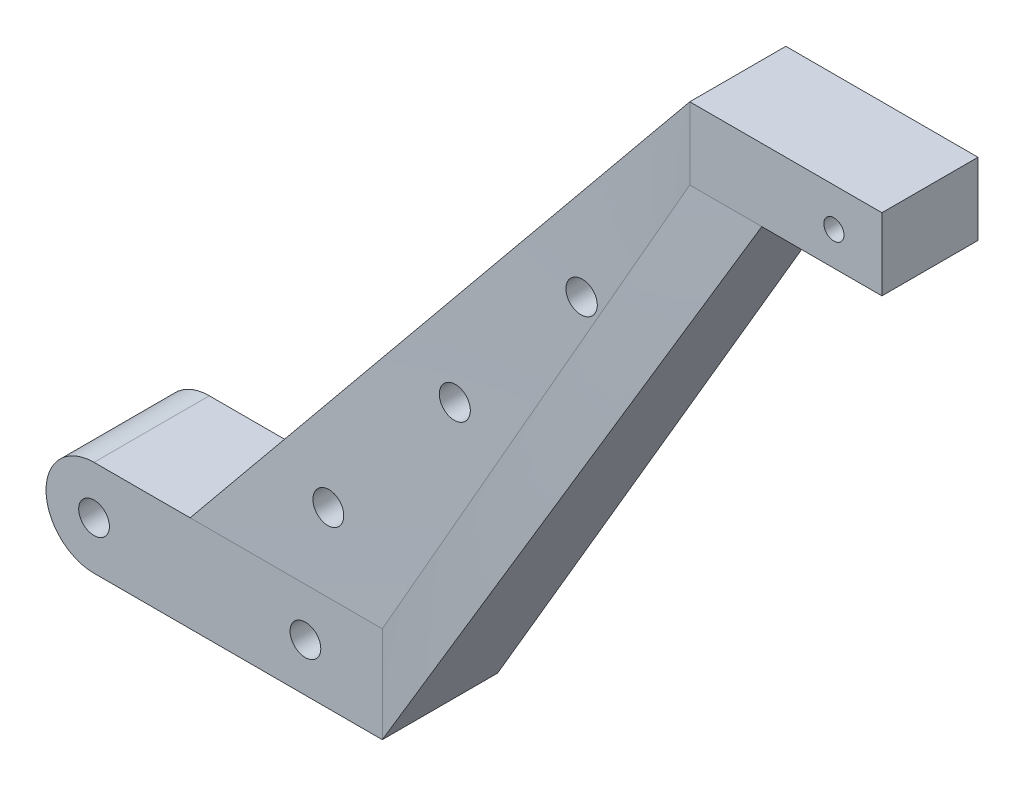
ISO-10303-21;
HEADER;
FILE_DESCRIPTION(('STEP AP214'),'2;1');
FILE_NAME('part.step','',(''),(''),'','','');
FILE_SCHEMA(('AUTOMOTIVE_DESIGN { 1 0 10303 214 1 1 1 1 }'));
ENDSEC;
DATA;
#1=APPLICATION_CONTEXT('core data for automotive mechanical design processes');
#2=APPLICATION_PROTOCOL_DEFINITION('international standard','automotive_design',2000,#1);
#3=PRODUCT_CONTEXT('',#1,'mechanical');
#4=PRODUCT('Part','Part','',(#3));
#5=PRODUCT_RELATED_PRODUCT_CATEGORY('part','',(#4));
#6=PRODUCT_DEFINITION_FORMATION('','',#4);
#7=PRODUCT_DEFINITION_CONTEXT('part definition',#1,'design');
#8=PRODUCT_DEFINITION('design','',#6,#7);
#9=PRODUCT_DEFINITION_SHAPE('','',#8);
#10=(LENGTH_UNIT() NAMED_UNIT(*) SI_UNIT(.MILLI.,.METRE.));
#11=(NAMED_UNIT(*) PLANE_ANGLE_UNIT() SI_UNIT($,.RADIAN.));
#12=(NAMED_UNIT(*) SI_UNIT($,.STERADIAN.) SOLID_ANGLE_UNIT());
#13=UNCERTAINTY_MEASURE_WITH_UNIT(LENGTH_MEASURE(1.E-05),#10,'distance_accuracy_value','');
#14=(GEOMETRIC_REPRESENTATION_CONTEXT(3) GLOBAL_UNCERTAINTY_ASSIGNED_CONTEXT((#13)) GLOBAL_UNIT_ASSIGNED_CONTEXT((#10,
#11,#12)) REPRESENTATION_CONTEXT('',''));
#15=CARTESIAN_POINT('',(0.,0.,0.));
#16=DIRECTION('',(0.,0.,1.));
#17=DIRECTION('',(1.,0.,0.));
#18=AXIS2_PLACEMENT_3D('',#15,#16,#17);
#19=CARTESIAN_POINT('',(-8.,0.,10.5254833995939));
#20=DIRECTION('',(0.,0.,-1.));
#21=DIRECTION('',(-1.,0.,0.));
#22=AXIS2_PLACEMENT_3D('',#19,#20,#21);
#23=CYLINDRICAL_SURFACE('',#22,1.6);
#24=CARTESIAN_POINT('',(-8.,0.,6.));
#25=DIRECTION('',(0.,0.,1.));
#26=DIRECTION('',(1.,0.,0.));
#27=AXIS2_PLACEMENT_3D('',#24,#25,#26);
#28=CIRCLE('',#27,1.6);
#29=CARTESIAN_POINT('',(-6.4,0.,6.));
#30=VERTEX_POINT('',#29);
#31=EDGE_CURVE('E421',#30,#30,#28,.F.);
#32=ORIENTED_EDGE('',*,*,#31,.F.);
#33=EDGE_LOOP('',(#32));
#34=FACE_BOUND('',#33,.T.);
#35=CARTESIAN_POINT('',(-8.,0.,-2.));
#36=DIRECTION('',(0.,0.,-1.));
#37=DIRECTION('',(-1.,0.,0.));
#38=AXIS2_PLACEMENT_3D('',#35,#36,#37);
#39=CIRCLE('',#38,1.6);
#40=CARTESIAN_POINT('',(-9.60000000000001,0.,-2.));
#41=VERTEX_POINT('',#40);
#42=EDGE_CURVE('E66',#41,#41,#39,.F.);
#43=ORIENTED_EDGE('',*,*,#42,.F.);
#44=EDGE_LOOP('',(#43));
#45=FACE_BOUND('',#44,.T.);
#46=ADVANCED_FACE('F62',(#34,#45),#23,.F.);
#47=CARTESIAN_POINT('',(-30.,0.,10.5254833995939));
#48=DIRECTION('',(0.,0.,-1.));
#49=DIRECTION('',(-1.,0.,0.));
#50=AXIS2_PLACEMENT_3D('',#47,#48,#49);
#51=CYLINDRICAL_SURFACE('',#50,1.6);
#52=CARTESIAN_POINT('',(-30.,0.,6.));
#53=DIRECTION('',(0.,0.,1.));
#54=DIRECTION('',(1.,0.,0.));
#55=AXIS2_PLACEMENT_3D('',#52,#53,#54);
#56=CIRCLE('',#55,1.6);
#57=CARTESIAN_POINT('',(-28.4,0.,6.));
#58=VERTEX_POINT('',#57);
#59=EDGE_CURVE('E383',#58,#58,#56,.F.);
#60=ORIENTED_EDGE('',*,*,#59,.F.);
#61=EDGE_LOOP('',(#60));
#62=FACE_BOUND('',#61,.T.);
#63=CARTESIAN_POINT('',(-30.,0.,-2.));
#64=DIRECTION('',(0.,0.,-1.));
#65=DIRECTION('',(-1.,0.,0.));
#66=AXIS2_PLACEMENT_3D('',#63,#64,#65);
#67=CIRCLE('',#66,1.6);
#68=CARTESIAN_POINT('',(-31.6,0.,-2.));
#69=VERTEX_POINT('',#68);
#70=EDGE_CURVE('E410',#69,#69,#67,.F.);
#71=ORIENTED_EDGE('',*,*,#70,.F.);
#72=EDGE_LOOP('',(#71));
#73=FACE_BOUND('',#72,.T.);
#74=ADVANCED_FACE('F345',(#62,#73),#51,.F.);
#75=CARTESIAN_POINT('',(-20.,-5.,-6.));
#76=DIRECTION('',(0.,0.,-1.));
#77=DIRECTION('',(-1.,0.,0.));
#78=AXIS2_PLACEMENT_3D('',#75,#76,#77);
#79=PLANE('',#78);
#80=CARTESIAN_POINT('',(19.3511806739083,43.8906747121906,-6.));
#81=DIRECTION('',(0.,0.,-1.));
#82=DIRECTION('',(-1.,0.,0.));
#83=AXIS2_PLACEMENT_3D('',#80,#81,#82);
#84=CIRCLE('',#83,1.6);
#85=CARTESIAN_POINT('',(17.7511806739083,43.8906747121906,-6.));
#86=VERTEX_POINT('',#85);
#87=EDGE_CURVE('E639',#86,#86,#84,.T.);
#88=ORIENTED_EDGE('',*,*,#87,.F.);
#89=EDGE_LOOP('',(#88));
#90=FACE_BOUND('',#89,.T.);
#91=CARTESIAN_POINT('',(6.73457898301116,28.3722546323871,-6.));
#92=DIRECTION('',(0.,0.,-1.));
#93=DIRECTION('',(-1.,0.,0.));
#94=AXIS2_PLACEMENT_3D('',#91,#92,#93);
#95=CIRCLE('',#94,1.6);
#96=CARTESIAN_POINT('',(5.13457898301115,28.3722546323871,-6.));
#97=VERTEX_POINT('',#96);
#98=EDGE_CURVE('E638',#97,#97,#95,.T.);
#99=ORIENTED_EDGE('',*,*,#98,.F.);
#100=EDGE_LOOP('',(#99));
#101=FACE_BOUND('',#100,.T.);
#102=CARTESIAN_POINT('',(-5.88202270788604,12.8538345525835,-6.));
#103=DIRECTION('',(0.,0.,-1.));
#104=DIRECTION('',(-1.,0.,0.));
#105=AXIS2_PLACEMENT_3D('',#102,#103,#104);
#106=CIRCLE('',#105,1.6);
#107=CARTESIAN_POINT('',(-7.48202270788604,12.8538345525835,-6.));
#108=VERTEX_POINT('',#107);
#109=EDGE_CURVE('E438',#108,#108,#106,.T.);
#110=ORIENTED_EDGE('',*,*,#109,.F.);
#111=EDGE_LOOP('',(#110));
#112=FACE_BOUND('',#111,.T.);
#113=CARTESIAN_POINT('',(-8.,0.,-6.));
#114=DIRECTION('',(0.,0.,-1.));
#115=DIRECTION('',(-1.,0.,0.));
#116=AXIS2_PLACEMENT_3D('',#113,#114,#115);
#117=CIRCLE('',#116,3.1);
#118=CARTESIAN_POINT('',(-11.1,0.,-6.));
#119=VERTEX_POINT('',#118);
#120=EDGE_CURVE('E425',#119,#119,#117,.T.);
#121=ORIENTED_EDGE('',*,*,#120,.F.);
#122=EDGE_LOOP('',(#121));
#123=FACE_BOUND('',#122,.T.);
#124=CARTESIAN_POINT('',(-30.,0.,-6.));
#125=DIRECTION('',(0.,0.,-1.));
#126=DIRECTION('',(-1.,0.,0.));
#127=AXIS2_PLACEMENT_3D('',#124,#125,#126);
#128=CIRCLE('',#127,3.1);
#129=CARTESIAN_POINT('',(-33.1,0.,-6.));
#130=VERTEX_POINT('',#129);
#131=EDGE_CURVE('E417',#130,#130,#128,.T.);
#132=ORIENTED_EDGE('',*,*,#131,.F.);
#133=EDGE_LOOP('',(#132));
#134=FACE_BOUND('',#133,.T.);
#135=CARTESIAN_POINT('',(45.,62.5,-6.));
#136=DIRECTION('',(0.,0.,-1.));
#137=DIRECTION('',(-1.,0.,0.));
#138=AXIS2_PLACEMENT_3D('',#135,#136,#137);
#139=CIRCLE('',#138,1.05);
#140=CARTESIAN_POINT('',(43.95,62.5,-6.));
#141=VERTEX_POINT('',#140);
#142=EDGE_CURVE('E142',#141,#141,#139,.T.);
#143=ORIENTED_EDGE('',*,*,#142,.F.);
#144=EDGE_LOOP('',(#143));
#145=FACE_BOUND('',#144,.T.);
#146=DIRECTION('',(1.,0.,0.));
#147=VECTOR('',#146,1.);
#148=CARTESIAN_POINT('',(-20.,-5.,-6.));
#149=LINE('',#148,#147);
#150=CARTESIAN_POINT('',(-30.,-5.,-6.));
#151=VERTEX_POINT('',#150);
#152=CARTESIAN_POINT('',(0.,-5.,-6.));
#153=VERTEX_POINT('',#152);
#154=EDGE_CURVE('E234',#151,#153,#149,.T.);
#155=ORIENTED_EDGE('',*,*,#154,.F.);
#156=CARTESIAN_POINT('',(-30.,0.,-6.));
#157=DIRECTION('',(0.,0.,-1.));
#158=DIRECTION('',(-1.,0.,0.));
#159=AXIS2_PLACEMENT_3D('',#156,#157,#158);
#160=CIRCLE('',#159,5.);
#161=CARTESIAN_POINT('',(-35.,0.,-6.));
#162=VERTEX_POINT('',#161);
#163=EDGE_CURVE('E71',#151,#162,#160,.T.);
#164=ORIENTED_EDGE('',*,*,#163,.T.);
#165=CARTESIAN_POINT('',(-30.,0.,-6.));
#166=DIRECTION('',(0.,0.,-1.));
#167=DIRECTION('',(-1.,0.,0.));
#168=AXIS2_PLACEMENT_3D('',#165,#166,#167);
#169=CIRCLE('',#168,5.);
#170=CARTESIAN_POINT('',(-30.,5.,-6.));
#171=VERTEX_POINT('',#170);
#172=EDGE_CURVE('E79',#162,#171,#169,.T.);
#173=ORIENTED_EDGE('',*,*,#172,.T.);
#174=DIRECTION('',(1.,0.,0.));
#175=VECTOR('',#174,1.);
#176=CARTESIAN_POINT('',(-35.,5.,-6.));
#177=LINE('',#176,#175);
#178=CARTESIAN_POINT('',(-20.,5.,-6.));
#179=VERTEX_POINT('',#178);
#180=EDGE_CURVE('E135',#171,#179,#177,.T.);
#181=ORIENTED_EDGE('',*,*,#180,.T.);
#182=DIRECTION('',(0.63083008454486,0.775921003990177,0.));
#183=VECTOR('',#182,1.);
#184=CARTESIAN_POINT('',(-20.,5.,-6.));
#185=LINE('',#184,#183);
#186=CARTESIAN_POINT('',(30.,66.5,-6.));
#187=VERTEX_POINT('',#186);
#188=EDGE_CURVE('E139',#179,#187,#185,.T.);
#189=ORIENTED_EDGE('',*,*,#188,.T.);
#190=DIRECTION('',(-1.,0.,0.));
#191=VECTOR('',#190,1.);
#192=CARTESIAN_POINT('',(62.5,66.5,-6.));
#193=LINE('',#192,#191);
#194=CARTESIAN_POINT('',(50.,66.5,-6.));
#195=VERTEX_POINT('',#194);
#196=EDGE_CURVE('E293',#195,#187,#193,.T.);
#197=ORIENTED_EDGE('',*,*,#196,.F.);
#198=DIRECTION('',(0.,1.,0.));
#199=VECTOR('',#198,1.);
#200=CARTESIAN_POINT('',(50.,59.,-6.));
#201=LINE('',#200,#199);
#202=CARTESIAN_POINT('',(50.,59.,-6.));
#203=VERTEX_POINT('',#202);
#204=EDGE_CURVE('E281',#203,#195,#201,.T.);
#205=ORIENTED_EDGE('',*,*,#204,.F.);
#206=DIRECTION('',(-1.,0.,0.));
#207=VECTOR('',#206,1.);
#208=CARTESIAN_POINT('',(62.5,59.,-6.));
#209=LINE('',#208,#207);
#210=CARTESIAN_POINT('',(37.5,59.,-6.));
#211=VERTEX_POINT('',#210);
#212=EDGE_CURVE('E698',#203,#211,#209,.T.);
#213=ORIENTED_EDGE('',*,*,#212,.T.);
#214=DIRECTION('',(0.505546500182335,0.862799360311186,0.));
#215=VECTOR('',#214,1.);
#216=CARTESIAN_POINT('',(0.,-5.,-6.));
#217=LINE('',#216,#215);
#218=EDGE_CURVE('E394',#153,#211,#217,.T.);
#219=ORIENTED_EDGE('',*,*,#218,.F.);
#220=EDGE_LOOP('',(#155,#164,#173,#181,#189,#197,#205,#213,#219));
#221=FACE_BOUND('',#220,.T.);
#222=ADVANCED_FACE('F137',(#90,#101,#112,#123,#134,#145,#221),#79,.T.);
#223=CARTESIAN_POINT('',(-20.,-5.,6.));
#224=DIRECTION('',(0.,-1.,0.));
#225=DIRECTION('',(0.,0.,-1.));
#226=AXIS2_PLACEMENT_3D('',#223,#224,#225);
#227=PLANE('',#226);
#228=DIRECTION('',(1.,0.,0.));
#229=VECTOR('',#228,1.);
#230=CARTESIAN_POINT('',(-20.,-5.,6.));
#231=LINE('',#230,#229);
#232=CARTESIAN_POINT('',(-30.,-5.,6.));
#233=VERTEX_POINT('',#232);
#234=CARTESIAN_POINT('',(0.,-5.00000000000001,6.));
#235=VERTEX_POINT('',#234);
#236=EDGE_CURVE('E299',#233,#235,#231,.T.);
#237=ORIENTED_EDGE('',*,*,#236,.F.);
#238=DIRECTION('',(0.,0.,1.));
#239=VECTOR('',#238,1.);
#240=CARTESIAN_POINT('',(-30.,-5.,6.));
#241=LINE('',#240,#239);
#242=EDGE_CURVE('E406',#233,#151,#241,.F.);
#243=ORIENTED_EDGE('',*,*,#242,.T.);
#244=ORIENTED_EDGE('',*,*,#154,.T.);
#245=DIRECTION('',(0.,0.,1.));
#246=VECTOR('',#245,1.);
#247=CARTESIAN_POINT('',(0.,-5.,0.));
#248=LINE('',#247,#246);
#249=EDGE_CURVE('E154',#235,#153,#248,.F.);
#250=ORIENTED_EDGE('',*,*,#249,.F.);
#251=EDGE_LOOP('',(#237,#243,#244,#250));
#252=FACE_BOUND('',#251,.T.);
#253=ADVANCED_FACE('F204',(#252),#227,.T.);
#254=CARTESIAN_POINT('',(-20.,-5.,6.));
#255=DIRECTION('',(0.,0.,1.));
#256=DIRECTION('',(1.,0.,0.));
#257=AXIS2_PLACEMENT_3D('',#254,#255,#256);
#258=PLANE('',#257);
#259=ORIENTED_EDGE('',*,*,#31,.T.);
#260=EDGE_LOOP('',(#259));
#261=FACE_BOUND('',#260,.T.);
#262=ORIENTED_EDGE('',*,*,#59,.T.);
#263=EDGE_LOOP('',(#262));
#264=FACE_BOUND('',#263,.T.);
#265=CARTESIAN_POINT('',(-30.,0.,6.));
#266=DIRECTION('',(0.,0.,1.));
#267=DIRECTION('',(1.,0.,0.));
#268=AXIS2_PLACEMENT_3D('',#265,#266,#267);
#269=CIRCLE('',#268,5.);
#270=CARTESIAN_POINT('',(-30.,5.00000000000001,6.));
#271=VERTEX_POINT('',#270);
#272=CARTESIAN_POINT('',(-35.,0.,6.));
#273=VERTEX_POINT('',#272);
#274=EDGE_CURVE('E380',#271,#273,#269,.T.);
#275=ORIENTED_EDGE('',*,*,#274,.T.);
#276=CARTESIAN_POINT('',(-30.,0.,6.));
#277=DIRECTION('',(0.,0.,1.));
#278=DIRECTION('',(1.,0.,0.));
#279=AXIS2_PLACEMENT_3D('',#276,#277,#278);
#280=CIRCLE('',#279,5.);
#281=EDGE_CURVE('E404',#273,#233,#280,.T.);
#282=ORIENTED_EDGE('',*,*,#281,.T.);
#283=ORIENTED_EDGE('',*,*,#236,.T.);
#284=DIRECTION('',(0.,1.,0.));
#285=VECTOR('',#284,1.);
#286=CARTESIAN_POINT('',(0.,-5.,6.));
#287=LINE('',#286,#285);
#288=CARTESIAN_POINT('',(0.,5.,6.));
#289=VERTEX_POINT('',#288);
#290=EDGE_CURVE('E305',#289,#235,#287,.F.);
#291=ORIENTED_EDGE('',*,*,#290,.F.);
#292=DIRECTION('',(1.,0.,0.));
#293=VECTOR('',#292,1.);
#294=CARTESIAN_POINT('',(-20.,5.,6.));
#295=LINE('',#294,#293);
#296=CARTESIAN_POINT('',(-20.,5.00000000000001,6.));
#297=VERTEX_POINT('',#296);
#298=EDGE_CURVE('E153',#297,#289,#295,.T.);
#299=ORIENTED_EDGE('',*,*,#298,.F.);
#300=DIRECTION('',(1.,0.,0.));
#301=VECTOR('',#300,1.);
#302=CARTESIAN_POINT('',(-35.,5.00000000000001,6.));
#303=LINE('',#302,#301);
#304=EDGE_CURVE('E143',#271,#297,#303,.T.);
#305=ORIENTED_EDGE('',*,*,#304,.F.);
#306=EDGE_LOOP('',(#275,#282,#283,#291,#299,#305));
#307=FACE_BOUND('',#306,.T.);
#308=ADVANCED_FACE('F191',(#261,#264,#307),#258,.T.);
#309=CARTESIAN_POINT('',(-20.,5.,6.));
#310=CARTESIAN_POINT('',(30.,66.5,4.));
#311=CARTESIAN_POINT('',(-16.6666666666667,5.,6.));
#312=CARTESIAN_POINT('',(30.,65.2500000000001,4.));
#313=CARTESIAN_POINT('',(-13.3333333333334,5.,6.));
#314=CARTESIAN_POINT('',(30.,64.0000000000001,4.));
#315=CARTESIAN_POINT('',(-6.66666666666669,5.,6.));
#316=CARTESIAN_POINT('',(30.,61.5000000000001,4.));
#317=CARTESIAN_POINT('',(-3.33333333333335,5.,6.));
#318=CARTESIAN_POINT('',(30.,60.2500000000001,4.));
#319=CARTESIAN_POINT('',(0.,5.,6.));
#320=CARTESIAN_POINT('',(30.,59.,4.));
#321=B_SPLINE_SURFACE_WITH_KNOTS('',3,1,((#309,#310),(#311,#312),(#313,#314),(#315,#316),(#317,
#318),(#319,#320)),.UNSPECIFIED.,.F.,.F.,.F.,(4,2,4),(2,2),(0.,0.5,1.),(0.,1.),.UNSPECIFIED.);
#322=CARTESIAN_POINT('',(17.7511806739083,43.8906747121906,4.63863409042264));
#323=CARTESIAN_POINT('',(17.7511868490406,43.9805914373397,4.63658575546257));
#324=CARTESIAN_POINT('',(17.7587961584548,44.0705992374646,4.63440716129093));
#325=CARTESIAN_POINT('',(17.7814312333638,44.2036019012685,4.63099191575641));
#326=CARTESIAN_POINT('',(17.7908589003539,44.2476368804599,4.6298279173723));
#327=CARTESIAN_POINT('',(17.8133964481496,44.334798816367,4.62745621261784));
#328=CARTESIAN_POINT('',(17.8265095705866,44.3779249376143,4.6262484685883));
#329=CARTESIAN_POINT('',(17.8712086472199,44.5052974986433,4.6225755091905));
#330=CARTESIAN_POINT('',(17.9081844004242,44.5877137918378,4.62005606098765));
#331=CARTESIAN_POINT('',(17.995466068831,44.7451566340811,4.61493716761436));
#332=CARTESIAN_POINT('',(18.0457722582729,44.8201830310582,4.61233772079912));
#333=CARTESIAN_POINT('',(18.1300971508337,44.9255603615749,4.608426555487));
#334=CARTESIAN_POINT('',(18.1597087568911,44.9595153458266,4.60711984367736));
#335=CARTESIAN_POINT('',(18.2216549885708,45.0247798633489,4.60451096463772));
#336=CARTESIAN_POINT('',(18.2539869697915,45.0560919077559,4.60320879424699));
#337=CARTESIAN_POINT('',(18.354801692953,45.1457864816102,4.59931787112034));
#338=CARTESIAN_POINT('',(18.4271242028868,45.1999536274924,4.59674373632719));
#339=CARTESIAN_POINT('',(18.5798070670834,45.2953443689165,4.59170281873527));
#340=CARTESIAN_POINT('',(18.6601675936106,45.3365676869784,4.58923603823887));
#341=CARTESIAN_POINT('',(18.8266849647929,45.4049402437812,4.58446930894987));
#342=CARTESIAN_POINT('',(18.9128417944383,45.4320895189658,4.58216935972531));
#343=CARTESIAN_POINT('',(19.0884791880144,45.4715254940166,4.57779682772231));
#344=CARTESIAN_POINT('',(19.1779591685744,45.4838147899218,4.57572420528742));
#345=CARTESIAN_POINT('',(19.3577187777926,45.4931905364122,4.57186305651001));
#346=CARTESIAN_POINT('',(19.4479984036994,45.49027703929,4.57007452919032));
#347=CARTESIAN_POINT('',(19.6267605785527,45.4693297696808,4.56683592538382));
#348=CARTESIAN_POINT('',(19.7152437373269,45.451301219106,4.56538573223129));
#349=CARTESIAN_POINT('',(19.8879314837967,45.4006400644545,4.56287159685272));
#350=CARTESIAN_POINT('',(19.9721360766433,45.3680074779601,4.56180765416165));
#351=CARTESIAN_POINT('',(20.1338400362799,45.2890793461998,4.56010789449616));
#352=CARTESIAN_POINT('',(20.211342118314,45.2427893675049,4.55947190344016));
#353=CARTESIAN_POINT('',(20.3574774394147,45.1378549133042,4.55865943857467));
#354=CARTESIAN_POINT('',(20.4261107006085,45.079210468623,4.55848296361869));
#355=CARTESIAN_POINT('',(20.5525388960452,44.9512525164668,4.55860967467943));
#356=CARTESIAN_POINT('',(20.6103371718556,44.8819423104169,4.55891271253874));
#357=CARTESIAN_POINT('',(20.7134813106214,44.7346080542264,4.56000391340338));
#358=CARTESIAN_POINT('',(20.7588271824729,44.6565840103111,4.56079207606213));
#359=CARTESIAN_POINT('',(20.8357793180382,44.4940418568423,4.56284269545549));
#360=CARTESIAN_POINT('',(20.8673862036478,44.4095240414335,4.56410513071729));
#361=CARTESIAN_POINT('',(20.9159695906047,44.2363907194214,4.56707562421779));
#362=CARTESIAN_POINT('',(20.9329460753177,44.1477752081593,4.56878368296315));
#363=CARTESIAN_POINT('',(20.9517939270986,43.9689338731141,4.57259916498806));
#364=CARTESIAN_POINT('',(20.9536607749726,43.8787075756415,4.57470670755774));
#365=CARTESIAN_POINT('',(20.9422289383347,43.6992295118291,4.57925683588179));
#366=CARTESIAN_POINT('',(20.928930209069,43.609977748366,4.58169942262485));
#367=CARTESIAN_POINT('',(20.8875369149023,43.4349307637618,4.58684233327167));
#368=CARTESIAN_POINT('',(20.859434385171,43.3491374301215,4.58954279527809));
#369=CARTESIAN_POINT('',(20.7892286912763,43.1834901982345,4.59511039475032));
#370=CARTESIAN_POINT('',(20.7471254858061,43.1036363175122,4.59797753270787));
#371=CARTESIAN_POINT('',(20.6500894286801,42.952093144025,4.60378326170539));
#372=CARTESIAN_POINT('',(20.5951502199154,42.8804079230956,4.60672188750199));
#373=CARTESIAN_POINT('',(20.4740124307846,42.7472814555333,4.61257048658159));
#374=CARTESIAN_POINT('',(20.4078138293757,42.685840228046,4.61548045981104));
#375=CARTESIAN_POINT('',(20.2660226641792,42.5749366919323,4.62117628831605));
#376=CARTESIAN_POINT('',(20.1904285183222,42.5254764048634,4.62396212258088));
#377=CARTESIAN_POINT('',(20.0320000947894,42.4399547840255,4.62932017664777));
#378=CARTESIAN_POINT('',(19.9491658312998,42.4038934240033,4.63189239686836));
#379=CARTESIAN_POINT('',(19.7786294807961,42.3462045780298,4.63674417383071));
#380=CARTESIAN_POINT('',(19.6909286006612,42.3245735306589,4.63902380267215));
#381=CARTESIAN_POINT('',(19.5131317003413,42.2963489984483,4.64322582610961));
#382=CARTESIAN_POINT('',(19.4230356820295,42.2897555018483,4.64514822098501));
#383=CARTESIAN_POINT('',(19.2430512550595,42.2917995274301,4.64858431940405));
#384=CARTESIAN_POINT('',(19.1531627646831,42.300429378936,4.65009822833072));
#385=CARTESIAN_POINT('',(18.9761150841138,42.3326546018805,4.65268352746278));
#386=CARTESIAN_POINT('',(18.8889558917988,42.3562499616831,4.65375491801225));
#387=CARTESIAN_POINT('',(18.7198350550942,42.417757814297,4.65543518867394));
#388=CARTESIAN_POINT('',(18.637871018464,42.4556636607189,4.65604428310112));
#389=CARTESIAN_POINT('',(18.520659629494,42.522367817596,4.65660772405487));
#390=CARTESIAN_POINT('',(18.4825384561442,42.5462487363542,4.65673716249721));
#391=CARTESIAN_POINT('',(18.408401888036,42.5971556642509,4.65688059454567));
#392=CARTESIAN_POINT('',(18.3723885533872,42.6241846755452,4.65689447702337));
#393=CARTESIAN_POINT('',(18.2680295096475,42.7096369791339,4.65676414609146));
#394=CARTESIAN_POINT('',(18.2032392324361,42.7724971473833,4.65644854363535));
#395=CARTESIAN_POINT('',(18.0851448783303,42.9082062099524,4.65537918433037));
#396=CARTESIAN_POINT('',(18.0318405897032,42.981054920103,4.65462543555922));
#397=CARTESIAN_POINT('',(17.9616185020223,43.0962258857114,4.65319048012273));
#398=CARTESIAN_POINT('',(17.9398166223885,43.1356415494074,4.65266075738738));
#399=CARTESIAN_POINT('',(17.8996267750024,43.2161272343554,4.65150496268967));
#400=CARTESIAN_POINT('',(17.8812358118434,43.2571957651394,4.65087897615676));
#401=CARTESIAN_POINT('',(17.8313921581564,43.3824508929119,4.64886396812736));
#402=CARTESIAN_POINT('',(17.8051906426527,43.4688153151329,4.64733629184219));
#403=CARTESIAN_POINT('',(17.7747151786244,43.6115389153899,4.6445968258828));
#404=CARTESIAN_POINT('',(17.7659019698694,43.6669895292536,4.64348177887483));
#405=CARTESIAN_POINT('',(17.7541327908756,43.7785065145927,4.64113942091856));
#406=CARTESIAN_POINT('',(17.7511768210523,43.8345728861117,4.63991210996228));
#407=CARTESIAN_POINT('',(17.7511806739083,43.8906747121906,4.63863409042264));
#408=B_SPLINE_CURVE_WITH_KNOTS('',3,(#322,#323,#324,#325,#326,#327,#328,#329,#330,#331,#332,
#333,#334,#335,#336,#337,#338,#339,#340,#341,#342,#343,#344,#345,#346,#347,#348,#349,#350,#351,
#352,#353,#354,#355,#356,#357,#358,#359,#360,#361,#362,#363,#364,#365,#366,#367,#368,#369,#370,
#371,#372,#373,#374,#375,#376,#377,#378,#379,#380,#381,#382,#383,#384,#385,#386,#387,#388,#389,
#390,#391,#392,#393,#394,#395,#396,#397,#398,#399,#400,#401,#402,#403,#404,#405,#406,#407),
.UNSPECIFIED.,.T.,.F.,(4,2,2,2,2,2,2,2,2,2,2,2,2,2,2,2,2,2,2,2,2,2,2,2,2,2,2,2,2,2,2,2,2,2,2,2,
2,2,2,2,2,2,4),(0.,0.269579873185288,0.404593394904157,0.539726044695658,0.809463429272279,
1.07920636343341,1.21428189722981,1.34922761212334,1.61901962567101,1.88881742242137,
2.15861452054563,2.42836447829132,2.69811350818471,2.9677693842174,3.23742493560415,
3.5069707304599,3.77651585280278,4.045977708736,4.31543937216334,4.58488883712665,
4.85433860844248,5.12386896744878,5.39340012184292,5.66307643935526,5.93275355251557,
6.20256450908822,6.4723759699172,6.74223292467451,7.01208935068611,7.2818791511248,
7.55166874057393,7.82132242842263,8.09097590660904,8.36050430018943,8.49531813064871,
8.63026159456136,8.89972054882019,9.16917453544819,9.3041716792669,9.43904970374999,
9.70836074447371,9.87655995392982,10.0447591753176),.UNSPECIFIED.);
#409=CARTESIAN_POINT('',(17.7511806739083,43.8906747121906,4.63863409042264));
#410=VERTEX_POINT('',#409);
#411=EDGE_CURVE('E632',#410,#410,#408,.T.);
#412=CARTESIAN_POINT('',(5.13457898301115,28.3722546323871,5.19837233669961));
#413=CARTESIAN_POINT('',(5.13458515339081,28.4621785052109,5.19575526539458));
#414=CARTESIAN_POINT('',(5.14219562809482,28.552194858375,5.19308653485072));
#415=CARTESIAN_POINT('',(5.16483558977882,28.6852128890913,5.18906626949558));
#416=CARTESIAN_POINT('',(5.17426539053349,28.7292533580959,5.18772220226742));
#417=CARTESIAN_POINT('',(5.19680853602746,28.8164271014453,5.18503499271499));
#418=CARTESIAN_POINT('',(5.20992512790227,28.8595595398838,5.1836918522571));
#419=CARTESIAN_POINT('',(5.25463741394249,28.9869531741633,5.1796825751069));
#420=CARTESIAN_POINT('',(5.29162550724364,29.0693851698064,5.17703131325247));
#421=CARTESIAN_POINT('',(5.37894051474713,29.2268596171467,5.17184276168557));
#422=CARTESIAN_POINT('',(5.42926766990489,29.301901935324,5.16930547403288));
#423=CARTESIAN_POINT('',(5.51362453318719,29.4072927021402,5.16563624701604));
#424=CARTESIAN_POINT('',(5.5432429574291,29.4412469187515,5.16443523125487));
#425=CARTESIAN_POINT('',(5.60520391868784,29.5065099576323,5.16208721664393));
#426=CARTESIAN_POINT('',(5.63754381077179,29.5378212904968,5.16094016699852));
#427=CARTESIAN_POINT('',(5.73838391428187,29.6275131812863,5.15758905472612));
#428=CARTESIAN_POINT('',(5.81072568606942,29.6816779816841,5.15547411193356));
#429=CARTESIAN_POINT('',(5.96342470362006,29.777043748968,5.15154501414259));
#430=CARTESIAN_POINT('',(6.04377938152551,29.8182488515144,5.14973076327588));
#431=CARTESIAN_POINT('',(6.21028328742073,29.8865886753051,5.14645056794418));
#432=CARTESIAN_POINT('',(6.29643249099672,29.9137234558271,5.14498462201181));
#433=CARTESIAN_POINT('',(6.47203129519682,29.9531291062575,5.14244400480889));
#434=CARTESIAN_POINT('',(6.56147952762355,29.9654060682421,5.14136917329817));
#435=CARTESIAN_POINT('',(6.74117209672453,29.9747683288929,5.13964276938599));
#436=CARTESIAN_POINT('',(6.83141643021387,29.9718536883077,5.13899119529201));
#437=CARTESIAN_POINT('',(7.01010400887669,29.9509170807433,5.1381342044617));
#438=CARTESIAN_POINT('',(7.09854789598733,29.9329005983992,5.13792862584751));
#439=CARTESIAN_POINT('',(7.2711570912576,29.8822787988651,5.13797452142833));
#440=CARTESIAN_POINT('',(7.35532240059797,29.8496734857011,5.13822599549721));
#441=CARTESIAN_POINT('',(7.51697128055752,29.7708069481083,5.13918504311472));
#442=CARTESIAN_POINT('',(7.59445593939297,29.7245479531889,5.13989254222134));
#443=CARTESIAN_POINT('',(7.74056053131984,29.6196866894808,5.14174973069142));
#444=CARTESIAN_POINT('',(7.80918046633816,29.561084423375,5.14289941995876));
#445=CARTESIAN_POINT('',(7.93561804176326,29.4331937458357,5.14561401079934));
#446=CARTESIAN_POINT('',(7.99343435096828,29.3639040194317,5.14717896348311));
#447=CARTESIAN_POINT('',(8.09661660380679,29.2166117653491,5.15068365749286));
#448=CARTESIAN_POINT('',(8.14198252368975,29.1386092210502,5.15262339953379));
#449=CARTESIAN_POINT('',(8.21899530621974,28.9760744399149,5.15682556552991));
#450=CARTESIAN_POINT('',(8.2506369677611,28.8915397418504,5.1590881113877));
#451=CARTESIAN_POINT('',(8.29928220101992,28.7183656238955,5.16387105843071));
#452=CARTESIAN_POINT('',(8.31628573429566,28.6297261932261,5.16639146029309));
#453=CARTESIAN_POINT('',(8.33518014208386,28.4508133759958,5.17161762720565));
#454=CARTESIAN_POINT('',(8.33706377715142,28.3605392274576,5.17432348042515));
#455=CARTESIAN_POINT('',(8.32564810424545,28.1809592257915,5.17983851420272));
#456=CARTESIAN_POINT('',(8.3123487603596,28.0916533749543,5.18264769500516));
#457=CARTESIAN_POINT('',(8.27093782884868,27.9165115958575,5.18828511582076));
#458=CARTESIAN_POINT('',(8.24282099259378,27.830676908756,5.19111336223663));
#459=CARTESIAN_POINT('',(8.17256945871675,27.6649471961125,5.19670133612585));
#460=CARTESIAN_POINT('',(8.13043475187078,27.5850521744789,5.19946106355411));
#461=CARTESIAN_POINT('',(8.03333950545751,27.4334666376431,5.20482750052592));
#462=CARTESIAN_POINT('',(7.9783783382479,27.3617765241909,5.20743420257361));
#463=CARTESIAN_POINT('',(7.85718971838872,27.2286428438893,5.21241486996038));
#464=CARTESIAN_POINT('',(7.79096227440876,27.1671992691551,5.21478883547856));
#465=CARTESIAN_POINT('',(7.64914060098048,27.0563228546524,5.2192317619576));
#466=CARTESIAN_POINT('',(7.57354907401107,27.0068865617142,5.22130081054194));
#467=CARTESIAN_POINT('',(7.41512965910217,26.9214095295981,5.22507356306375));
#468=CARTESIAN_POINT('',(7.33230179721291,26.8853687421999,5.22677726831635));
#469=CARTESIAN_POINT('',(7.1618035215669,26.8277245289945,5.22976984220198));
#470=CARTESIAN_POINT('',(7.07413547406859,26.8061141149933,5.23105891147369));
#471=CARTESIAN_POINT('',(6.89641078623136,26.7779189549076,5.23318841494529));
#472=CARTESIAN_POINT('',(6.80635414792149,26.7713341960597,5.23402884952627));
#473=CARTESIAN_POINT('',(6.62644814470788,26.7733815959803,5.23524035763122));
#474=CARTESIAN_POINT('',(6.53659870536229,26.7820069798983,5.23561163999696));
#475=CARTESIAN_POINT('',(6.35963146902158,26.8142085016381,5.23588002214894));
#476=CARTESIAN_POINT('',(6.27251367344425,26.8377846472195,5.23577712168908));
#477=CARTESIAN_POINT('',(6.10344997309104,26.8992462412304,5.235105136965));
#478=CARTESIAN_POINT('',(6.02150314276145,26.937129120363,5.23453613638466));
#479=CARTESIAN_POINT('',(5.90431601902488,27.003791581829,5.23335133279399));
#480=CARTESIAN_POINT('',(5.86620264977963,27.0276574143242,5.2329010672692));
#481=CARTESIAN_POINT('',(5.79208077112465,27.0785316684555,5.23189353598434));
#482=CARTESIAN_POINT('',(5.75607431873439,27.1055430867295,5.23133616785912));
#483=CARTESIAN_POINT('',(5.65170811929293,27.1909599056932,5.22951103321412));
#484=CARTESIAN_POINT('',(5.58690509746325,27.2538028542741,5.22808925440578));
#485=CARTESIAN_POINT('',(5.46878406318634,27.3894762171411,5.22488054239566));
#486=CARTESIAN_POINT('',(5.41546586698495,27.4623064716025,5.22309361503705));
#487=CARTESIAN_POINT('',(5.34521344786651,27.5774614209903,5.22018059243389));
#488=CARTESIAN_POINT('',(5.32339730337291,27.6168801101167,5.21916951497705));
#489=CARTESIAN_POINT('',(5.28318012865802,27.6973729939247,5.21707805422482));
#490=CARTESIAN_POINT('',(5.26477610165386,27.7384456969563,5.21599773287791));
#491=CARTESIAN_POINT('',(5.21489495662357,27.8637152198574,5.21266425633573));
#492=CARTESIAN_POINT('',(5.18867076361922,27.9500915894334,5.21031534536889));
#493=CARTESIAN_POINT('',(5.1581549305556,28.0928751205305,5.2063527491669));
#494=CARTESIAN_POINT('',(5.14932628477565,28.1483728967013,5.20479370413052));
#495=CARTESIAN_POINT('',(5.13753638386244,28.2599866391628,5.20162059937674));
#496=CARTESIAN_POINT('',(5.13457512998178,28.3161026055854,5.20000653964759));
#497=CARTESIAN_POINT('',(5.13457898301115,28.3722546323871,5.19837233669961));
#498=B_SPLINE_CURVE_WITH_KNOTS('',3,(#412,#413,#414,#415,#416,#417,#418,#419,#420,#421,#422,
#423,#424,#425,#426,#427,#428,#429,#430,#431,#432,#433,#434,#435,#436,#437,#438,#439,#440,#441,
#442,#443,#444,#445,#446,#447,#448,#449,#450,#451,#452,#453,#454,#455,#456,#457,#458,#459,#460,
#461,#462,#463,#464,#465,#466,#467,#468,#469,#470,#471,#472,#473,#474,#475,#476,#477,#478,#479,
#480,#481,#482,#483,#484,#485,#486,#487,#488,#489,#490,#491,#492,#493,#494,#495,#496,#497),
.UNSPECIFIED.,.T.,.F.,(4,2,2,2,2,2,2,2,2,2,2,2,2,2,2,2,2,2,2,2,2,2,2,2,2,2,2,2,2,2,2,2,2,2,2,2,
2,2,2,2,2,2,4),(0.,0.269645392415277,0.404691344073701,0.539856611962328,0.809662700382377,
1.07947366288361,1.21455200578465,1.34950055261623,1.61929756438912,1.88900839177849,
2.15871808288014,2.42831714877102,2.69791513658085,2.96741525511884,3.2369152992837,
3.50637136111387,3.7758273643727,4.04531654761374,4.31480624493191,4.58439798217771,
4.85399042740599,5.12371194647314,5.39343410351431,5.66325186541254,5.93306980485267,
6.2029009501715,6.47273188785097,6.74248513282531,7.01223740674941,7.28185895287206,
7.55148026996722,7.8209815235778,8.09048291706483,8.35993593472363,8.49471227942591,
8.62961808545368,8.89910094613984,9.16857949485151,9.30362995417522,9.438561234066,
9.70797917202181,9.87635639593339,10.0447336557907),.UNSPECIFIED.);
#499=CARTESIAN_POINT('',(5.13457898301115,28.3722546323871,5.19837233669961));
#500=VERTEX_POINT('',#499);
#501=EDGE_CURVE('E641',#500,#500,#498,.T.);
#502=CARTESIAN_POINT('',(-7.48202270788604,12.8538345525835,5.73361285811631));
#503=CARTESIAN_POINT('',(-7.48201654060523,12.9437576378023,5.73068649079305));
#504=CARTESIAN_POINT('',(-7.47440622285824,13.0337742381184,5.72774737137163));
#505=CARTESIAN_POINT('',(-7.45176575971644,13.1667946141794,5.72338712829528));
#506=CARTESIAN_POINT('',(-7.44233568404413,13.2108361513006,5.72194061346531));
#507=CARTESIAN_POINT('',(-7.41979156293276,13.298012687793,5.71907109432937));
#508=CARTESIAN_POINT('',(-7.40667426747698,13.3411468511652,5.71764811194246));
#509=CARTESIAN_POINT('',(-7.36195872044597,13.4685472304638,5.71343484693804));
#510=CARTESIAN_POINT('',(-7.32496704772786,13.5509850763536,5.71069455487591));
#511=CARTESIAN_POINT('',(-7.23764113573967,13.7084721700425,5.70542679154949));
#512=CARTESIAN_POINT('',(-7.18730667405156,13.7835212946465,5.70289932383381));
#513=CARTESIAN_POINT('',(-7.10293967274861,13.8889168064782,5.69932034443365));
#514=CARTESIAN_POINT('',(-7.07332035454094,13.9228695995326,5.69816212155457));
#515=CARTESIAN_POINT('',(-7.01135733961438,13.9881301275333,5.69592469197346));
#516=CARTESIAN_POINT('',(-6.97901628782102,14.0194403725084,5.69484541042188));
#517=CARTESIAN_POINT('',(-6.8781723222523,14.1091292041894,5.69173501452877));
#518=CARTESIAN_POINT('',(-6.80582738993267,14.1632923300939,5.68983045143427));
#519=CARTESIAN_POINT('',(-6.65313408582669,14.2586463896739,5.68641783363671));
#520=CARTESIAN_POINT('',(-6.57278961703003,14.2998436090098,5.68490958686468));
#521=CARTESIAN_POINT('',(-6.40630804795045,14.3681714272505,5.68232949637301));
#522=CARTESIAN_POINT('',(-6.32017097552105,14.3953020937882,5.68125765055512));
#523=CARTESIAN_POINT('',(-6.14460443297554,14.4347022716355,5.67958268674529));
#524=CARTESIAN_POINT('',(-6.0551765575188,14.4469788857075,5.67897934477833));
#525=CARTESIAN_POINT('',(-5.87552650887393,14.4563474644554,5.67825985859914));
#526=CARTESIAN_POINT('',(-5.78530433873601,14.4534394874168,5.67814371251681));
#527=CARTESIAN_POINT('',(-5.60665562635773,14.4325235654486,5.67840515906249));
#528=CARTESIAN_POINT('',(-5.51822856194398,14.4145200779904,5.6787826059585));
#529=CARTESIAN_POINT('',(-5.34565239029148,14.3639313279243,5.68002411102053));
#530=CARTESIAN_POINT('',(-5.26150328564447,14.3313460564823,5.68088816948136));
#531=CARTESIAN_POINT('',(-5.09986920411733,14.2525199582585,5.68308239653252));
#532=CARTESIAN_POINT('',(-5.02238435692422,14.206278865811,5.68441257419103));
#533=CARTESIAN_POINT('',(-4.87627739882647,14.101456354078,5.68750497705521));
#534=CARTESIAN_POINT('',(-4.8076552969435,14.0428749222311,5.68926720270067));
#535=CARTESIAN_POINT('',(-4.68119580160557,13.9150143543437,5.69317733122818));
#536=CARTESIAN_POINT('',(-4.62336209099956,13.8457315798704,5.69532536532484));
#537=CARTESIAN_POINT('',(-4.52014534653044,13.6984507173514,5.69994763039104));
#538=CARTESIAN_POINT('',(-4.47476234872304,13.6204526040679,5.70242186230518));
#539=CARTESIAN_POINT('',(-4.3977098563188,13.4579113501449,5.70762829940386));
#540=CARTESIAN_POINT('',(-4.3660475925418,13.3733647860714,5.71036063968985));
#541=CARTESIAN_POINT('',(-4.31736625719617,13.2001617867856,5.71600386777709));
#542=CARTESIAN_POINT('',(-4.30034722763457,13.1115053397842,5.71891475609053));
#543=CARTESIAN_POINT('',(-4.28142824721115,12.9325534574421,5.72483187772506));
#544=CARTESIAN_POINT('',(-4.27953558496303,12.842257252987,5.72783815630945));
#545=CARTESIAN_POINT('',(-4.29094139834801,12.6626295373977,5.73385628987575));
#546=CARTESIAN_POINT('',(-4.30423990055016,12.5732980279511,5.73686814486741));
#547=CARTESIAN_POINT('',(-4.34565583184655,12.3981158565992,5.74280880045194));
#548=CARTESIAN_POINT('',(-4.37377639784122,12.3122659356712,5.74573758332535));
#549=CARTESIAN_POINT('',(-4.44404202283254,12.1465050578174,5.75142422891499));
#550=CARTESIAN_POINT('',(-4.48618707499838,12.0665940979989,5.75418209171447));
#551=CARTESIAN_POINT('',(-4.5832995207414,11.9149948335918,5.75944429680597));
#552=CARTESIAN_POINT('',(-4.63826477850448,11.8433051623215,5.7619486812273));
#553=CARTESIAN_POINT('',(-4.75946336646586,11.7101720818672,5.76663011019588));
#554=CARTESIAN_POINT('',(-4.82569667549018,11.6487286534298,5.76880715535821));
#555=CARTESIAN_POINT('',(-4.96751825856302,11.5378638535094,5.77276887495764));
#556=CARTESIAN_POINT('',(-5.04310210215573,11.4884368211052,5.7745537341152));
#557=CARTESIAN_POINT('',(-5.20150396920387,11.402975179561,5.77768067535532));
#558=CARTESIAN_POINT('',(-5.28432196239896,11.3669405144043,5.77902275928989));
#559=CARTESIAN_POINT('',(-5.45479189419847,11.3093072571813,5.78122570186122));
#560=CARTESIAN_POINT('',(-5.54244111130588,11.2877006257725,5.78208682844499));
#561=CARTESIAN_POINT('',(-5.72012559852478,11.2595066290495,5.78330615373468));
#562=CARTESIAN_POINT('',(-5.81016086694341,11.2529192530797,5.78366435279742));
#563=CARTESIAN_POINT('',(-5.99002806748595,11.254953976007,5.78387020099182));
#564=CARTESIAN_POINT('',(-6.0798600645363,11.2635702216574,5.78371804658429));
#565=CARTESIAN_POINT('',(-6.25679218624202,11.2957467093531,5.78291167022587));
#566=CARTESIAN_POINT('',(-6.34389230741302,11.3193069704578,5.78225744763463));
#567=CARTESIAN_POINT('',(-6.51293583047588,11.3807341785458,5.78046832928036));
#568=CARTESIAN_POINT('',(-6.59487933756425,11.4186008335638,5.77933344332665));
#569=CARTESIAN_POINT('',(-6.71206265820073,11.4852364039999,5.77730029717789));
#570=CARTESIAN_POINT('',(-6.75017497125305,11.5090928569889,5.77656727912255));
#571=CARTESIAN_POINT('',(-6.82429531131293,11.5599474750144,5.77499562674714));
#572=CARTESIAN_POINT('',(-6.86030128283597,11.5869486344575,5.77415689169925));
#573=CARTESIAN_POINT('',(-6.96468039951636,11.6723441923878,5.77149274749363));
#574=CARTESIAN_POINT('',(-7.02949624839969,11.7351771227289,5.76951798003392));
#575=CARTESIAN_POINT('',(-7.14764340372067,11.8708316372602,5.76523059957429));
#576=CARTESIAN_POINT('',(-7.20097488132356,11.9436530725534,5.76291799161048));
#577=CARTESIAN_POINT('',(-7.27125131289563,12.0588016523458,5.75924678091554));
#578=CARTESIAN_POINT('',(-7.29307735342922,12.0982223665302,5.75798766540452));
#579=CARTESIAN_POINT('',(-7.33331358315941,12.1787203083362,5.75541212140603));
#580=CARTESIAN_POINT('',(-7.35172676994688,12.2197960433323,5.75409574447963));
#581=CARTESIAN_POINT('',(-7.40163424744541,12.3450762502614,5.7500744704751));
#582=CARTESIAN_POINT('',(-7.42787445408658,12.4314617892551,5.74729334690794));
#583=CARTESIAN_POINT('',(-7.45841825523989,12.5742875708492,5.74268125226582));
#584=CARTESIAN_POINT('',(-7.46725750906643,12.6298176617972,5.74088479804538));
#585=CARTESIAN_POINT('',(-7.47906166297586,12.7414978494335,5.73726484145142));
#586=CARTESIAN_POINT('',(-7.48202656138571,12.7976479462984,5.73544133907021));
#587=CARTESIAN_POINT('',(-7.48202270788604,12.8538345525835,5.73361285811631));
#588=B_SPLINE_CURVE_WITH_KNOTS('',3,(#502,#503,#504,#505,#506,#507,#508,#509,#510,#511,#512,
#513,#514,#515,#516,#517,#518,#519,#520,#521,#522,#523,#524,#525,#526,#527,#528,#529,#530,#531,
#532,#533,#534,#535,#536,#537,#538,#539,#540,#541,#542,#543,#544,#545,#546,#547,#548,#549,#550,
#551,#552,#553,#554,#555,#556,#557,#558,#559,#560,#561,#562,#563,#564,#565,#566,#567,#568,#569,
#570,#571,#572,#573,#574,#575,#576,#577,#578,#579,#580,#581,#582,#583,#584,#585,#586,#587),
.UNSPECIFIED.,.T.,.F.,(4,2,2,2,2,2,2,2,2,2,2,2,2,2,2,2,2,2,2,2,2,2,2,2,2,2,2,2,2,2,2,2,2,2,2,2,
2,2,2,2,2,2,4),(0.,0.269671504278306,0.404730253433434,0.539908422388116,0.809742497529682,
1.07958107096147,1.21465456900581,1.34959828843349,1.61938529504773,1.88904131113518,
2.15869603068509,2.42822175841129,2.69774645157131,2.96719158626034,3.23663688418777,
3.50608742435842,3.77553823880934,4.04508086842135,4.31462427858686,4.58430956575333,
4.85399562656329,5.12381162730139,5.39362809994334,5.66350169873603,5.93337516608339,
6.20320370526151,6.47303173740645,6.7427324062342,7.01243194696297,7.28198108464332,
7.55153003108835,7.82097522644864,8.09042076545789,8.35986080591194,8.49463077160926,
8.62953013167624,8.89905100631456,9.16856786368461,9.30365671676646,9.43862634992289,
9.70812113100594,9.87661982391709,10.0451185648169),.UNSPECIFIED.);
#589=CARTESIAN_POINT('',(-7.48202270788604,12.8538345525835,5.73361285811631));
#590=VERTEX_POINT('',#589);
#591=EDGE_CURVE('E429',#590,#590,#588,.T.);
#592=DIRECTION('',(0.48538860126793,0.873699482282274,-0.0323592400845287));
#593=VECTOR('',#592,1.);
#594=CARTESIAN_POINT('',(15.,32.,5.));
#595=LINE('',#594,#593);
#596=CARTESIAN_POINT('',(30.,59.,4.));
#597=VERTEX_POINT('',#596);
#598=EDGE_CURVE('E160',#289,#597,#595,.T.);
#599=DIRECTION('',(0.,1.,0.));
#600=VECTOR('',#599,1.);
#601=CARTESIAN_POINT('',(30.,0.,4.));
#602=LINE('',#601,#600);
#603=CARTESIAN_POINT('',(30.,66.5,4.));
#604=VERTEX_POINT('',#603);
#605=EDGE_CURVE('E162',#597,#604,#602,.T.);
#606=DIRECTION('',(-0.630629351049608,-0.775674101791018,0.0252251740419843));
#607=VECTOR('',#606,1.);
#608=CARTESIAN_POINT('',(5.,35.75,5.));
#609=LINE('',#608,#607);
#610=EDGE_CURVE('E165',#604,#297,#609,.T.);
#611=ORIENTED_EDGE('',*,*,#411,.T.);
#612=EDGE_LOOP('',(#611));
#613=FACE_BOUND('',#612,.T.);
#614=ORIENTED_EDGE('',*,*,#501,.T.);
#615=EDGE_LOOP('',(#614));
#616=FACE_BOUND('',#615,.T.);
#617=ORIENTED_EDGE('',*,*,#591,.T.);
#618=EDGE_LOOP('',(#617));
#619=FACE_BOUND('',#618,.T.);
#620=ORIENTED_EDGE('',*,*,#298,.T.);
#621=ORIENTED_EDGE('',*,*,#598,.T.);
#622=ORIENTED_EDGE('',*,*,#605,.T.);
#623=ORIENTED_EDGE('',*,*,#610,.T.);
#624=EDGE_LOOP('',(#620,#621,#622,#623));
#625=FACE_BOUND('',#624,.T.);
#626=ADVANCED_FACE('F179',(#613,#616,#619,#625),#321,.T.);
#627=CARTESIAN_POINT('',(-14.4884396513988,11.7792192287795,0.));
#628=DIRECTION('',(-0.775921003990177,0.63083008454486,0.));
#629=DIRECTION('',(-0.63083008454486,-0.775921003990177,0.));
#630=AXIS2_PLACEMENT_3D('',#627,#628,#629);
#631=PLANE('',#630);
#632=ORIENTED_EDGE('',*,*,#610,.F.);
#633=DIRECTION('',(0.,0.,-1.));
#634=VECTOR('',#633,1.);
#635=CARTESIAN_POINT('',(30.,66.5,0.));
#636=LINE('',#635,#634);
#637=EDGE_CURVE('E158',#604,#187,#636,.T.);
#638=ORIENTED_EDGE('',*,*,#637,.T.);
#639=ORIENTED_EDGE('',*,*,#188,.F.);
#640=DIRECTION('',(0.,0.,1.));
#641=VECTOR('',#640,1.);
#642=CARTESIAN_POINT('',(-20.,5.00000000000001,0.));
#643=LINE('',#642,#641);
#644=EDGE_CURVE('E146',#179,#297,#643,.T.);
#645=ORIENTED_EDGE('',*,*,#644,.T.);
#646=EDGE_LOOP('',(#632,#638,#639,#645));
#647=FACE_BOUND('',#646,.T.);
#648=ADVANCED_FACE('F157',(#647),#631,.T.);
#649=CARTESIAN_POINT('',(62.5,66.5,4.));
#650=DIRECTION('',(0.,0.,-1.));
#651=DIRECTION('',(-1.,0.,0.));
#652=AXIS2_PLACEMENT_3D('',#649,#650,#651);
#653=PLANE('',#652);
#654=CARTESIAN_POINT('',(45.,62.5,4.));
#655=DIRECTION('',(0.,0.,-1.));
#656=DIRECTION('',(-1.,0.,0.));
#657=AXIS2_PLACEMENT_3D('',#654,#655,#656);
#658=CIRCLE('',#657,1.05);
#659=CARTESIAN_POINT('',(43.95,62.5,4.));
#660=VERTEX_POINT('',#659);
#661=EDGE_CURVE('E390',#660,#660,#658,.F.);
#662=ORIENTED_EDGE('',*,*,#661,.F.);
#663=EDGE_LOOP('',(#662));
#664=FACE_BOUND('',#663,.T.);
#665=DIRECTION('',(0.,-1.,0.));
#666=VECTOR('',#665,1.);
#667=CARTESIAN_POINT('',(50.,66.5,4.));
#668=LINE('',#667,#666);
#669=CARTESIAN_POINT('',(50.,66.5,4.));
#670=VERTEX_POINT('',#669);
#671=CARTESIAN_POINT('',(50.,59.,4.));
#672=VERTEX_POINT('',#671);
#673=EDGE_CURVE('E287',#670,#672,#668,.T.);
#674=ORIENTED_EDGE('',*,*,#673,.F.);
#675=DIRECTION('',(-1.,0.,0.));
#676=VECTOR('',#675,1.);
#677=CARTESIAN_POINT('',(62.5,66.5,4.));
#678=LINE('',#677,#676);
#679=EDGE_CURVE('E271',#670,#604,#678,.T.);
#680=ORIENTED_EDGE('',*,*,#679,.T.);
#681=ORIENTED_EDGE('',*,*,#605,.F.);
#682=DIRECTION('',(-1.,0.,0.));
#683=VECTOR('',#682,1.);
#684=CARTESIAN_POINT('',(30.,59.,4.));
#685=LINE('',#684,#683);
#686=CARTESIAN_POINT('',(37.5,59.,4.));
#687=VERTEX_POINT('',#686);
#688=EDGE_CURVE('E262',#687,#597,#685,.T.);
#689=ORIENTED_EDGE('',*,*,#688,.F.);
#690=DIRECTION('',(-1.,0.,0.));
#691=VECTOR('',#690,1.);
#692=CARTESIAN_POINT('',(62.5,59.,4.));
#693=LINE('',#692,#691);
#694=EDGE_CURVE('E696',#672,#687,#693,.T.);
#695=ORIENTED_EDGE('',*,*,#694,.F.);
#696=EDGE_LOOP('',(#674,#680,#681,#689,#695));
#697=FACE_BOUND('',#696,.T.);
#698=ADVANCED_FACE('F203',(#664,#697),#653,.F.);
#699=CARTESIAN_POINT('',(62.5,59.,4.));
#700=DIRECTION('',(0.,1.,0.));
#701=DIRECTION('',(0.,0.,1.));
#702=AXIS2_PLACEMENT_3D('',#699,#700,#701);
#703=PLANE('',#702);
#704=ORIENTED_EDGE('',*,*,#694,.T.);
#705=DIRECTION('',(0.,0.,1.));
#706=VECTOR('',#705,1.);
#707=CARTESIAN_POINT('',(37.5,59.,4.));
#708=LINE('',#707,#706);
#709=EDGE_CURVE('E228',#211,#687,#708,.T.);
#710=ORIENTED_EDGE('',*,*,#709,.F.);
#711=ORIENTED_EDGE('',*,*,#212,.F.);
#712=DIRECTION('',(0.,0.,-1.));
#713=VECTOR('',#712,1.);
#714=CARTESIAN_POINT('',(50.,59.,4.));
#715=LINE('',#714,#713);
#716=EDGE_CURVE('E284',#672,#203,#715,.T.);
#717=ORIENTED_EDGE('',*,*,#716,.F.);
#718=EDGE_LOOP('',(#704,#710,#711,#717));
#719=FACE_BOUND('',#718,.T.);
#720=ADVANCED_FACE('F236',(#719),#703,.F.);
#721=CARTESIAN_POINT('',(62.5,66.5,-6.));
#722=DIRECTION('',(0.,-1.,0.));
#723=DIRECTION('',(0.,0.,-1.));
#724=AXIS2_PLACEMENT_3D('',#721,#722,#723);
#725=PLANE('',#724);
#726=DIRECTION('',(0.,0.,1.));
#727=VECTOR('',#726,1.);
#728=CARTESIAN_POINT('',(50.,66.5,-6.));
#729=LINE('',#728,#727);
#730=EDGE_CURVE('E290',#195,#670,#729,.T.);
#731=ORIENTED_EDGE('',*,*,#730,.F.);
#732=ORIENTED_EDGE('',*,*,#196,.T.);
#733=ORIENTED_EDGE('',*,*,#637,.F.);
#734=ORIENTED_EDGE('',*,*,#679,.F.);
#735=EDGE_LOOP('',(#731,#732,#733,#734));
#736=FACE_BOUND('',#735,.T.);
#737=ADVANCED_FACE('F244',(#736),#725,.F.);
#738=CARTESIAN_POINT('',(50.,0.,0.));
#739=DIRECTION('',(1.,0.,0.));
#740=DIRECTION('',(0.,0.,-1.));
#741=AXIS2_PLACEMENT_3D('',#738,#739,#740);
#742=PLANE('',#741);
#743=ORIENTED_EDGE('',*,*,#730,.T.);
#744=ORIENTED_EDGE('',*,*,#673,.T.);
#745=ORIENTED_EDGE('',*,*,#716,.T.);
#746=ORIENTED_EDGE('',*,*,#204,.T.);
#747=EDGE_LOOP('',(#743,#744,#745,#746));
#748=FACE_BOUND('',#747,.T.);
#749=ADVANCED_FACE('F193',(#748),#742,.T.);
#750=CARTESIAN_POINT('',(0.,5.,6.));
#751=CARTESIAN_POINT('',(30.,59.,4.));
#752=CARTESIAN_POINT('',(0.,3.33333333333334,6.));
#753=CARTESIAN_POINT('',(31.2500000000001,59.,4.));
#754=CARTESIAN_POINT('',(0.,1.66666666666667,6.));
#755=CARTESIAN_POINT('',(32.5000000000002,59.,4.));
#756=CARTESIAN_POINT('',(0.,-1.66666666666666,6.));
#757=CARTESIAN_POINT('',(35.0000000000002,59.,4.));
#758=CARTESIAN_POINT('',(0.,-3.33333333333333,6.));
#759=CARTESIAN_POINT('',(36.2500000000001,59.,4.));
#760=CARTESIAN_POINT('',(0.,-5.,6.));
#761=CARTESIAN_POINT('',(37.5,59.,4.));
#762=B_SPLINE_SURFACE_WITH_KNOTS('',3,1,((#750,#751),(#752,#753),(#754,#755),(#756,#757),(#758,
#759),(#760,#761)),.UNSPECIFIED.,.F.,.F.,.F.,(4,2,4),(2,2),(0.,0.5,1.),(0.,1.),.UNSPECIFIED.);
#763=DIRECTION('',(0.505362840396907,0.862485914277388,-0.0269526848211684));
#764=VECTOR('',#763,1.);
#765=CARTESIAN_POINT('',(18.75,27.,5.));
#766=LINE('',#765,#764);
#767=EDGE_CURVE('E308',#235,#687,#766,.T.);
#768=ORIENTED_EDGE('',*,*,#290,.T.);
#769=ORIENTED_EDGE('',*,*,#767,.T.);
#770=ORIENTED_EDGE('',*,*,#688,.T.);
#771=ORIENTED_EDGE('',*,*,#598,.F.);
#772=EDGE_LOOP('',(#768,#769,#770,#771));
#773=FACE_BOUND('',#772,.T.);
#774=ADVANCED_FACE('F303',(#773),#762,.T.);
#775=CARTESIAN_POINT('',(2.18092598482439,-1.27788631923304,0.));
#776=DIRECTION('',(0.862799360311186,-0.505546500182336,0.));
#777=DIRECTION('',(0.505546500182335,0.862799360311186,0.));
#778=AXIS2_PLACEMENT_3D('',#775,#776,#777);
#779=PLANE('',#778);
#780=ORIENTED_EDGE('',*,*,#218,.T.);
#781=ORIENTED_EDGE('',*,*,#709,.T.);
#782=ORIENTED_EDGE('',*,*,#767,.F.);
#783=ORIENTED_EDGE('',*,*,#249,.T.);
#784=EDGE_LOOP('',(#780,#781,#782,#783));
#785=FACE_BOUND('',#784,.T.);
#786=ADVANCED_FACE('F328',(#785),#779,.T.);
#787=CARTESIAN_POINT('',(45.,62.5,6.9698484809835));
#788=DIRECTION('',(0.,0.,-1.));
#789=DIRECTION('',(-1.,0.,0.));
#790=AXIS2_PLACEMENT_3D('',#787,#788,#789);
#791=CYLINDRICAL_SURFACE('',#790,1.05);
#792=ORIENTED_EDGE('',*,*,#661,.T.);
#793=EDGE_LOOP('',(#792));
#794=FACE_BOUND('',#793,.T.);
#795=ORIENTED_EDGE('',*,*,#142,.T.);
#796=EDGE_LOOP('',(#795));
#797=FACE_BOUND('',#796,.T.);
#798=ADVANCED_FACE('F329',(#794,#797),#791,.F.);
#799=CARTESIAN_POINT('',(-35.,5.00000000000001,6.));
#800=DIRECTION('',(0.,-1.,0.));
#801=DIRECTION('',(0.,0.,-1.));
#802=AXIS2_PLACEMENT_3D('',#799,#800,#801);
#803=PLANE('',#802);
#804=ORIENTED_EDGE('',*,*,#180,.F.);
#805=DIRECTION('',(0.,0.,-1.));
#806=VECTOR('',#805,1.);
#807=CARTESIAN_POINT('',(-30.,5.00000000000001,6.));
#808=LINE('',#807,#806);
#809=EDGE_CURVE('E14',#171,#271,#808,.F.);
#810=ORIENTED_EDGE('',*,*,#809,.T.);
#811=ORIENTED_EDGE('',*,*,#304,.T.);
#812=ORIENTED_EDGE('',*,*,#644,.F.);
#813=EDGE_LOOP('',(#804,#810,#811,#812));
#814=FACE_BOUND('',#813,.T.);
#815=ADVANCED_FACE('F147',(#814),#803,.F.);
#816=CARTESIAN_POINT('',(-30.,0.,0.));
#817=DIRECTION('',(0.,0.,1.));
#818=DIRECTION('',(0.,-1.,0.));
#819=AXIS2_PLACEMENT_3D('',#816,#817,#818);
#820=CYLINDRICAL_SURFACE('',#819,5.);
#821=ORIENTED_EDGE('',*,*,#809,.F.);
#822=ORIENTED_EDGE('',*,*,#172,.F.);
#823=DIRECTION('',(0.,0.,-1.));
#824=VECTOR('',#823,1.);
#825=CARTESIAN_POINT('',(-35.,0.,-6.));
#826=LINE('',#825,#824);
#827=EDGE_CURVE('E381',#273,#162,#826,.T.);
#828=ORIENTED_EDGE('',*,*,#827,.F.);
#829=ORIENTED_EDGE('',*,*,#274,.F.);
#830=EDGE_LOOP('',(#821,#822,#828,#829));
#831=FACE_BOUND('',#830,.T.);
#832=ADVANCED_FACE('F64',(#831),#820,.T.);
#833=CARTESIAN_POINT('',(-30.,0.,0.));
#834=DIRECTION('',(0.,0.,1.));
#835=DIRECTION('',(1.,0.,0.));
#836=AXIS2_PLACEMENT_3D('',#833,#834,#835);
#837=CYLINDRICAL_SURFACE('',#836,5.);
#838=ORIENTED_EDGE('',*,*,#163,.F.);
#839=ORIENTED_EDGE('',*,*,#242,.F.);
#840=ORIENTED_EDGE('',*,*,#281,.F.);
#841=ORIENTED_EDGE('',*,*,#827,.T.);
#842=EDGE_LOOP('',(#838,#839,#840,#841));
#843=FACE_BOUND('',#842,.T.);
#844=ADVANCED_FACE('F363',(#843),#837,.T.);
#845=CARTESIAN_POINT('',(-30.,0.,-2.));
#846=DIRECTION('',(0.,0.,-1.));
#847=DIRECTION('',(-1.,0.,0.));
#848=AXIS2_PLACEMENT_3D('',#845,#846,#847);
#849=PLANE('',#848);
#850=CARTESIAN_POINT('',(-30.,0.,-2.));
#851=DIRECTION('',(0.,0.,-1.));
#852=DIRECTION('',(-1.,0.,0.));
#853=AXIS2_PLACEMENT_3D('',#850,#851,#852);
#854=CIRCLE('',#853,3.1);
#855=CARTESIAN_POINT('',(-33.1,0.,-2.));
#856=VERTEX_POINT('',#855);
#857=EDGE_CURVE('E412',#856,#856,#854,.T.);
#858=ORIENTED_EDGE('',*,*,#857,.T.);
#859=EDGE_LOOP('',(#858));
#860=FACE_BOUND('',#859,.T.);
#861=ORIENTED_EDGE('',*,*,#70,.T.);
#862=EDGE_LOOP('',(#861));
#863=FACE_BOUND('',#862,.T.);
#864=ADVANCED_FACE('F359',(#860,#863),#849,.T.);
#865=CARTESIAN_POINT('',(-30.,0.,-2.));
#866=DIRECTION('',(0.,0.,-1.));
#867=DIRECTION('',(-1.,0.,0.));
#868=AXIS2_PLACEMENT_3D('',#865,#866,#867);
#869=CYLINDRICAL_SURFACE('',#868,3.1);
#870=ORIENTED_EDGE('',*,*,#857,.F.);
#871=EDGE_LOOP('',(#870));
#872=FACE_BOUND('',#871,.T.);
#873=ORIENTED_EDGE('',*,*,#131,.T.);
#874=EDGE_LOOP('',(#873));
#875=FACE_BOUND('',#874,.T.);
#876=ADVANCED_FACE('F362',(#872,#875),#869,.F.);
#877=CARTESIAN_POINT('',(-8.,0.,-2.));
#878=DIRECTION('',(0.,0.,-1.));
#879=DIRECTION('',(-1.,0.,0.));
#880=AXIS2_PLACEMENT_3D('',#877,#878,#879);
#881=PLANE('',#880);
#882=CARTESIAN_POINT('',(-8.,0.,-2.));
#883=DIRECTION('',(0.,0.,-1.));
#884=DIRECTION('',(-1.,0.,0.));
#885=AXIS2_PLACEMENT_3D('',#882,#883,#884);
#886=CIRCLE('',#885,3.1);
#887=CARTESIAN_POINT('',(-11.1,0.,-2.));
#888=VERTEX_POINT('',#887);
#889=EDGE_CURVE('E428',#888,#888,#886,.T.);
#890=ORIENTED_EDGE('',*,*,#889,.T.);
#891=EDGE_LOOP('',(#890));
#892=FACE_BOUND('',#891,.T.);
#893=ORIENTED_EDGE('',*,*,#42,.T.);
#894=EDGE_LOOP('',(#893));
#895=FACE_BOUND('',#894,.T.);
#896=ADVANCED_FACE('F366',(#892,#895),#881,.T.);
#897=CARTESIAN_POINT('',(-8.,0.,-2.));
#898=DIRECTION('',(0.,0.,-1.));
#899=DIRECTION('',(-1.,0.,0.));
#900=AXIS2_PLACEMENT_3D('',#897,#898,#899);
#901=CYLINDRICAL_SURFACE('',#900,3.1);
#902=ORIENTED_EDGE('',*,*,#889,.F.);
#903=EDGE_LOOP('',(#902));
#904=FACE_BOUND('',#903,.T.);
#905=ORIENTED_EDGE('',*,*,#120,.T.);
#906=EDGE_LOOP('',(#905));
#907=FACE_BOUND('',#906,.T.);
#908=ADVANCED_FACE('F357',(#904,#907),#901,.F.);
#909=CARTESIAN_POINT('',(-5.88202270788604,12.8538345525835,6.001025));
#910=DIRECTION('',(0.,0.,-1.));
#911=DIRECTION('',(-1.,0.,0.));
#912=AXIS2_PLACEMENT_3D('',#909,#910,#911);
#913=CYLINDRICAL_SURFACE('',#912,1.6);
#914=ORIENTED_EDGE('',*,*,#109,.T.);
#915=EDGE_LOOP('',(#914));
#916=FACE_BOUND('',#915,.T.);
#917=ORIENTED_EDGE('',*,*,#591,.F.);
#918=EDGE_LOOP('',(#917));
#919=FACE_BOUND('',#918,.T.);
#920=ADVANCED_FACE('F440',(#916,#919),#913,.F.);
#921=CARTESIAN_POINT('',(6.73457898301116,28.3722546323871,6.001025));
#922=DIRECTION('',(0.,0.,-1.));
#923=DIRECTION('',(-1.,0.,0.));
#924=AXIS2_PLACEMENT_3D('',#921,#922,#923);
#925=CYLINDRICAL_SURFACE('',#924,1.6);
#926=ORIENTED_EDGE('',*,*,#98,.T.);
#927=EDGE_LOOP('',(#926));
#928=FACE_BOUND('',#927,.T.);
#929=ORIENTED_EDGE('',*,*,#501,.F.);
#930=EDGE_LOOP('',(#929));
#931=FACE_BOUND('',#930,.T.);
#932=ADVANCED_FACE('F602',(#928,#931),#925,.F.);
#933=CARTESIAN_POINT('',(19.3511806739083,43.8906747121906,6.001025));
#934=DIRECTION('',(0.,0.,-1.));
#935=DIRECTION('',(-1.,0.,0.));
#936=AXIS2_PLACEMENT_3D('',#933,#934,#935);
#937=CYLINDRICAL_SURFACE('',#936,1.6);
#938=ORIENTED_EDGE('',*,*,#87,.T.);
#939=EDGE_LOOP('',(#938));
#940=FACE_BOUND('',#939,.T.);
#941=ORIENTED_EDGE('',*,*,#411,.F.);
#942=EDGE_LOOP('',(#941));
#943=FACE_BOUND('',#942,.T.);
#944=ADVANCED_FACE('F609',(#940,#943),#937,.F.);
#945=CLOSED_SHELL('',(#46,#74,#222,#253,#308,#626,#648,#698,#720,#737,#749,#774,#786,#798,#815,
#832,#844,#864,#876,#896,#908,#920,#932,#944));
#946=MANIFOLD_SOLID_BREP('B2',#945);
#947=ADVANCED_BREP_SHAPE_REPRESENTATION('',(#18,#946),#14);
#948=SHAPE_DEFINITION_REPRESENTATION(#9,#947);
ENDSEC;
END-ISO-10303-21;
